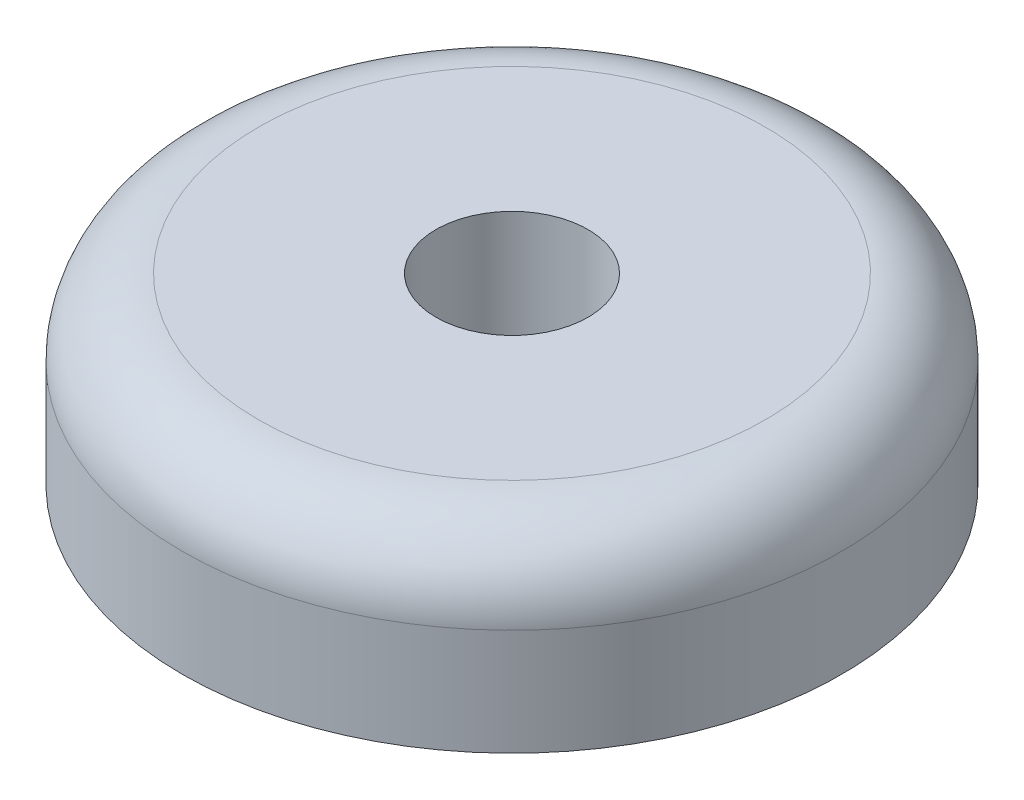
ISO-10303-21;
HEADER;
FILE_DESCRIPTION(('STEP AP214'),'2;1');
FILE_NAME('part.step','',(''),(''),'','','');
FILE_SCHEMA(('AUTOMOTIVE_DESIGN { 1 0 10303 214 1 1 1 1 }'));
ENDSEC;
DATA;
#1=APPLICATION_CONTEXT('core data for automotive mechanical design processes');
#2=APPLICATION_PROTOCOL_DEFINITION('international standard','automotive_design',2000,#1);
#3=PRODUCT_CONTEXT('',#1,'mechanical');
#4=PRODUCT('Part','Part','',(#3));
#5=PRODUCT_RELATED_PRODUCT_CATEGORY('part','',(#4));
#6=PRODUCT_DEFINITION_FORMATION('','',#4);
#7=PRODUCT_DEFINITION_CONTEXT('part definition',#1,'design');
#8=PRODUCT_DEFINITION('design','',#6,#7);
#9=PRODUCT_DEFINITION_SHAPE('','',#8);
#10=(LENGTH_UNIT() NAMED_UNIT(*) SI_UNIT(.MILLI.,.METRE.));
#11=(NAMED_UNIT(*) PLANE_ANGLE_UNIT() SI_UNIT($,.RADIAN.));
#12=(NAMED_UNIT(*) SI_UNIT($,.STERADIAN.) SOLID_ANGLE_UNIT());
#13=UNCERTAINTY_MEASURE_WITH_UNIT(LENGTH_MEASURE(1.E-05),#10,'distance_accuracy_value','');
#14=(GEOMETRIC_REPRESENTATION_CONTEXT(3) GLOBAL_UNCERTAINTY_ASSIGNED_CONTEXT((#13)) GLOBAL_UNIT_ASSIGNED_CONTEXT((#10,
#11,#12)) REPRESENTATION_CONTEXT('',''));
#15=CARTESIAN_POINT('',(0.,0.,0.));
#16=DIRECTION('',(0.,0.,1.));
#17=DIRECTION('',(1.,0.,0.));
#18=AXIS2_PLACEMENT_3D('',#15,#16,#17);
#19=CARTESIAN_POINT('',(0.,3.6,0.));
#20=DIRECTION('',(0.,1.,0.));
#21=DIRECTION('',(0.,0.,1.));
#22=AXIS2_PLACEMENT_3D('',#19,#20,#21);
#23=PLANE('',#22);
#24=CARTESIAN_POINT('',(0.,3.6,0.));
#25=DIRECTION('',(0.,1.,0.));
#26=DIRECTION('',(0.,0.,1.));
#27=AXIS2_PLACEMENT_3D('',#24,#25,#26);
#28=CIRCLE('',#27,5.);
#29=CARTESIAN_POINT('',(0.,3.6,5.));
#30=VERTEX_POINT('',#29);
#31=EDGE_CURVE('E51',#30,#30,#28,.T.);
#32=ORIENTED_EDGE('',*,*,#31,.T.);
#33=EDGE_LOOP('',(#32));
#34=FACE_BOUND('',#33,.T.);
#35=CARTESIAN_POINT('',(0.,3.6,0.));
#36=DIRECTION('',(0.,1.,0.));
#37=DIRECTION('',(0.,0.,1.));
#38=AXIS2_PLACEMENT_3D('',#35,#36,#37);
#39=CIRCLE('',#38,1.5);
#40=CARTESIAN_POINT('',(0.,3.6,1.5));
#41=VERTEX_POINT('',#40);
#42=EDGE_CURVE('E61',#41,#41,#39,.T.);
#43=ORIENTED_EDGE('',*,*,#42,.F.);
#44=EDGE_LOOP('',(#43));
#45=FACE_BOUND('',#44,.T.);
#46=ADVANCED_FACE('F43',(#34,#45),#23,.T.);
#47=CARTESIAN_POINT('',(0.,0.,0.));
#48=DIRECTION('',(0.,1.,0.));
#49=DIRECTION('',(0.,0.,1.));
#50=AXIS2_PLACEMENT_3D('',#47,#48,#49);
#51=PLANE('',#50);
#52=CARTESIAN_POINT('',(0.,0.,0.));
#53=DIRECTION('',(0.,1.,0.));
#54=DIRECTION('',(0.,0.,1.));
#55=AXIS2_PLACEMENT_3D('',#52,#53,#54);
#56=CIRCLE('',#55,6.5);
#57=CARTESIAN_POINT('',(0.,0.,6.5));
#58=VERTEX_POINT('',#57);
#59=EDGE_CURVE('E56',#58,#58,#56,.T.);
#60=ORIENTED_EDGE('',*,*,#59,.F.);
#61=EDGE_LOOP('',(#60));
#62=FACE_BOUND('',#61,.T.);
#63=CARTESIAN_POINT('',(0.,0.,0.));
#64=DIRECTION('',(0.,1.,0.));
#65=DIRECTION('',(0.,0.,1.));
#66=AXIS2_PLACEMENT_3D('',#63,#64,#65);
#67=CIRCLE('',#66,1.5);
#68=CARTESIAN_POINT('',(0.,0.,1.5));
#69=VERTEX_POINT('',#68);
#70=EDGE_CURVE('E64',#69,#69,#67,.T.);
#71=ORIENTED_EDGE('',*,*,#70,.T.);
#72=EDGE_LOOP('',(#71));
#73=FACE_BOUND('',#72,.T.);
#74=ADVANCED_FACE('F76',(#62,#73),#51,.F.);
#75=CARTESIAN_POINT('',(0.,3.6,0.));
#76=DIRECTION('',(0.,-1.,0.));
#77=DIRECTION('',(0.,0.,-1.));
#78=AXIS2_PLACEMENT_3D('',#75,#76,#77);
#79=CYLINDRICAL_SURFACE('',#78,6.5);
#80=CARTESIAN_POINT('',(0.,2.1,0.));
#81=DIRECTION('',(0.,1.,0.));
#82=DIRECTION('',(0.,0.,1.));
#83=AXIS2_PLACEMENT_3D('',#80,#81,#82);
#84=CIRCLE('',#83,6.5);
#85=CARTESIAN_POINT('',(0.,2.1,6.5));
#86=VERTEX_POINT('',#85);
#87=EDGE_CURVE('E10',#86,#86,#84,.F.);
#88=ORIENTED_EDGE('',*,*,#87,.T.);
#89=EDGE_LOOP('',(#88));
#90=FACE_BOUND('',#89,.T.);
#91=ORIENTED_EDGE('',*,*,#59,.T.);
#92=EDGE_LOOP('',(#91));
#93=FACE_BOUND('',#92,.T.);
#94=ADVANCED_FACE('F83',(#90,#93),#79,.T.);
#95=CARTESIAN_POINT('',(0.,3.6,0.));
#96=DIRECTION('',(0.,-1.,0.));
#97=DIRECTION('',(0.,0.,-1.));
#98=AXIS2_PLACEMENT_3D('',#95,#96,#97);
#99=CYLINDRICAL_SURFACE('',#98,1.5);
#100=ORIENTED_EDGE('',*,*,#42,.T.);
#101=EDGE_LOOP('',(#100));
#102=FACE_BOUND('',#101,.T.);
#103=ORIENTED_EDGE('',*,*,#70,.F.);
#104=EDGE_LOOP('',(#103));
#105=FACE_BOUND('',#104,.T.);
#106=ADVANCED_FACE('F72',(#102,#105),#99,.F.);
#107=CARTESIAN_POINT('',(0.,2.1,0.));
#108=DIRECTION('',(0.,1.,0.));
#109=DIRECTION('',(0.,0.,1.));
#110=AXIS2_PLACEMENT_3D('',#107,#108,#109);
#111=TOROIDAL_SURFACE('',#110,5.,1.5);
#112=ORIENTED_EDGE('',*,*,#87,.F.);
#113=EDGE_LOOP('',(#112));
#114=FACE_BOUND('',#113,.T.);
#115=ORIENTED_EDGE('',*,*,#31,.F.);
#116=EDGE_LOOP('',(#115));
#117=FACE_BOUND('',#116,.T.);
#118=ADVANCED_FACE('F45',(#114,#117),#111,.T.);
#119=CLOSED_SHELL('',(#46,#74,#94,#106,#118));
#120=MANIFOLD_SOLID_BREP('B2',#119);
#121=ADVANCED_BREP_SHAPE_REPRESENTATION('',(#18,#120),#14);
#122=SHAPE_DEFINITION_REPRESENTATION(#9,#121);
ENDSEC;
END-ISO-10303-21;
